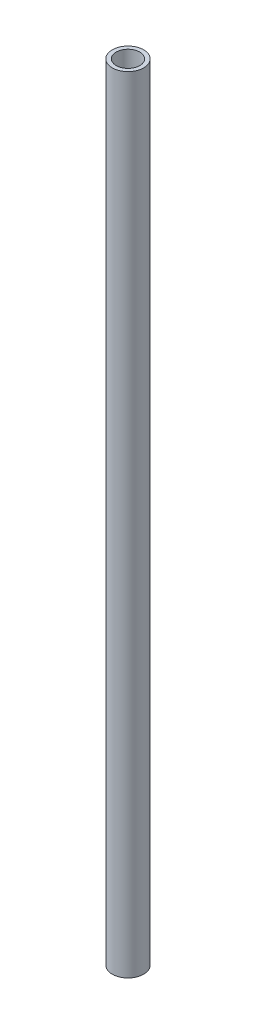
ISO-10303-21;
HEADER;
FILE_DESCRIPTION(('STEP AP214'),'2;1');
FILE_NAME('part.step','',(''),(''),'','','');
FILE_SCHEMA(('AUTOMOTIVE_DESIGN { 1 0 10303 214 1 1 1 1 }'));
ENDSEC;
DATA;
#1=APPLICATION_CONTEXT('core data for automotive mechanical design processes');
#2=APPLICATION_PROTOCOL_DEFINITION('international standard','automotive_design',2000,#1);
#3=PRODUCT_CONTEXT('',#1,'mechanical');
#4=PRODUCT('Part','Part','',(#3));
#5=PRODUCT_RELATED_PRODUCT_CATEGORY('part','',(#4));
#6=PRODUCT_DEFINITION_FORMATION('','',#4);
#7=PRODUCT_DEFINITION_CONTEXT('part definition',#1,'design');
#8=PRODUCT_DEFINITION('design','',#6,#7);
#9=PRODUCT_DEFINITION_SHAPE('','',#8);
#10=(LENGTH_UNIT() NAMED_UNIT(*) SI_UNIT(.MILLI.,.METRE.));
#11=(NAMED_UNIT(*) PLANE_ANGLE_UNIT() SI_UNIT($,.RADIAN.));
#12=(NAMED_UNIT(*) SI_UNIT($,.STERADIAN.) SOLID_ANGLE_UNIT());
#13=UNCERTAINTY_MEASURE_WITH_UNIT(LENGTH_MEASURE(1.E-05),#10,'distance_accuracy_value','');
#14=(GEOMETRIC_REPRESENTATION_CONTEXT(3) GLOBAL_UNCERTAINTY_ASSIGNED_CONTEXT((#13)) GLOBAL_UNIT_ASSIGNED_CONTEXT((#10,
#11,#12)) REPRESENTATION_CONTEXT('',''));
#15=CARTESIAN_POINT('',(0.,0.,0.));
#16=DIRECTION('',(0.,0.,1.));
#17=DIRECTION('',(1.,0.,0.));
#18=AXIS2_PLACEMENT_3D('',#15,#16,#17);
#19=CARTESIAN_POINT('',(0.,200.,0.));
#20=DIRECTION('',(0.,1.,0.));
#21=DIRECTION('',(0.,0.,1.));
#22=AXIS2_PLACEMENT_3D('',#19,#20,#21);
#23=PLANE('',#22);
#24=CARTESIAN_POINT('',(0.,200.,0.));
#25=DIRECTION('',(0.,1.,0.));
#26=DIRECTION('',(0.,0.,1.));
#27=AXIS2_PLACEMENT_3D('',#24,#25,#26);
#28=CIRCLE('',#27,4.);
#29=CARTESIAN_POINT('',(0.,200.,4.));
#30=VERTEX_POINT('',#29);
#31=EDGE_CURVE('E10',#30,#30,#28,.T.);
#32=ORIENTED_EDGE('',*,*,#31,.T.);
#33=EDGE_LOOP('',(#32));
#34=FACE_BOUND('',#33,.T.);
#35=CARTESIAN_POINT('',(0.,200.,0.));
#36=DIRECTION('',(0.,1.,0.));
#37=DIRECTION('',(0.,0.,1.));
#38=AXIS2_PLACEMENT_3D('',#35,#36,#37);
#39=CIRCLE('',#38,3.);
#40=CARTESIAN_POINT('',(0.,200.,3.));
#41=VERTEX_POINT('',#40);
#42=EDGE_CURVE('E54',#41,#41,#39,.T.);
#43=ORIENTED_EDGE('',*,*,#42,.F.);
#44=EDGE_LOOP('',(#43));
#45=FACE_BOUND('',#44,.T.);
#46=ADVANCED_FACE('F41',(#34,#45),#23,.T.);
#47=CARTESIAN_POINT('',(0.,0.,0.));
#48=DIRECTION('',(0.,1.,0.));
#49=DIRECTION('',(0.,0.,1.));
#50=AXIS2_PLACEMENT_3D('',#47,#48,#49);
#51=PLANE('',#50);
#52=CARTESIAN_POINT('',(0.,0.,0.));
#53=DIRECTION('',(0.,1.,0.));
#54=DIRECTION('',(0.,0.,1.));
#55=AXIS2_PLACEMENT_3D('',#52,#53,#54);
#56=CIRCLE('',#55,4.);
#57=CARTESIAN_POINT('',(0.,0.,4.));
#58=VERTEX_POINT('',#57);
#59=EDGE_CURVE('E45',#58,#58,#56,.T.);
#60=ORIENTED_EDGE('',*,*,#59,.F.);
#61=EDGE_LOOP('',(#60));
#62=FACE_BOUND('',#61,.T.);
#63=CARTESIAN_POINT('',(0.,0.,0.));
#64=DIRECTION('',(0.,1.,0.));
#65=DIRECTION('',(0.,0.,1.));
#66=AXIS2_PLACEMENT_3D('',#63,#64,#65);
#67=CIRCLE('',#66,3.);
#68=CARTESIAN_POINT('',(0.,0.,3.));
#69=VERTEX_POINT('',#68);
#70=EDGE_CURVE('E56',#69,#69,#67,.T.);
#71=ORIENTED_EDGE('',*,*,#70,.T.);
#72=EDGE_LOOP('',(#71));
#73=FACE_BOUND('',#72,.T.);
#74=ADVANCED_FACE('F68',(#62,#73),#51,.F.);
#75=CARTESIAN_POINT('',(0.,200.,0.));
#76=DIRECTION('',(0.,-1.,0.));
#77=DIRECTION('',(0.,0.,-1.));
#78=AXIS2_PLACEMENT_3D('',#75,#76,#77);
#79=CYLINDRICAL_SURFACE('',#78,4.);
#80=ORIENTED_EDGE('',*,*,#31,.F.);
#81=EDGE_LOOP('',(#80));
#82=FACE_BOUND('',#81,.T.);
#83=ORIENTED_EDGE('',*,*,#59,.T.);
#84=EDGE_LOOP('',(#83));
#85=FACE_BOUND('',#84,.T.);
#86=ADVANCED_FACE('F43',(#82,#85),#79,.T.);
#87=CARTESIAN_POINT('',(0.,200.,0.));
#88=DIRECTION('',(0.,-1.,0.));
#89=DIRECTION('',(0.,0.,-1.));
#90=AXIS2_PLACEMENT_3D('',#87,#88,#89);
#91=CYLINDRICAL_SURFACE('',#90,3.);
#92=ORIENTED_EDGE('',*,*,#42,.T.);
#93=EDGE_LOOP('',(#92));
#94=FACE_BOUND('',#93,.T.);
#95=ORIENTED_EDGE('',*,*,#70,.F.);
#96=EDGE_LOOP('',(#95));
#97=FACE_BOUND('',#96,.T.);
#98=ADVANCED_FACE('F64',(#94,#97),#91,.F.);
#99=CLOSED_SHELL('',(#46,#74,#86,#98));
#100=MANIFOLD_SOLID_BREP('B2',#99);
#101=ADVANCED_BREP_SHAPE_REPRESENTATION('',(#18,#100),#14);
#102=SHAPE_DEFINITION_REPRESENTATION(#9,#101);
ENDSEC;
END-ISO-10303-21;
